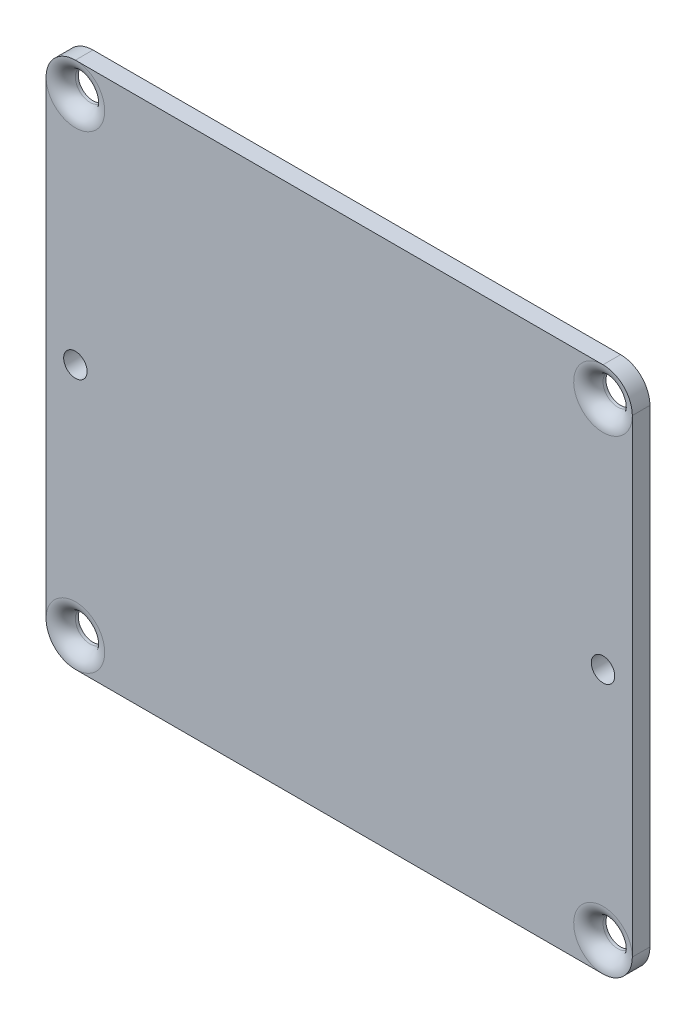
ISO-10303-21;
HEADER;
FILE_DESCRIPTION(('STEP AP214'),'2;1');
FILE_NAME('part.step','',(''),(''),'','','');
FILE_SCHEMA(('AUTOMOTIVE_DESIGN { 1 0 10303 214 1 1 1 1 }'));
ENDSEC;
DATA;
#1=APPLICATION_CONTEXT('core data for automotive mechanical design processes');
#2=APPLICATION_PROTOCOL_DEFINITION('international standard','automotive_design',2000,#1);
#3=PRODUCT_CONTEXT('',#1,'mechanical');
#4=PRODUCT('Part','Part','',(#3));
#5=PRODUCT_RELATED_PRODUCT_CATEGORY('part','',(#4));
#6=PRODUCT_DEFINITION_FORMATION('','',#4);
#7=PRODUCT_DEFINITION_CONTEXT('part definition',#1,'design');
#8=PRODUCT_DEFINITION('design','',#6,#7);
#9=PRODUCT_DEFINITION_SHAPE('','',#8);
#10=(LENGTH_UNIT() NAMED_UNIT(*) SI_UNIT(.MILLI.,.METRE.));
#11=(NAMED_UNIT(*) PLANE_ANGLE_UNIT() SI_UNIT($,.RADIAN.));
#12=(NAMED_UNIT(*) SI_UNIT($,.STERADIAN.) SOLID_ANGLE_UNIT());
#13=UNCERTAINTY_MEASURE_WITH_UNIT(LENGTH_MEASURE(1.E-05),#10,'distance_accuracy_value','');
#14=(GEOMETRIC_REPRESENTATION_CONTEXT(3) GLOBAL_UNCERTAINTY_ASSIGNED_CONTEXT((#13)) GLOBAL_UNIT_ASSIGNED_CONTEXT((#10,
#11,#12)) REPRESENTATION_CONTEXT('',''));
#15=CARTESIAN_POINT('',(0.,0.,0.));
#16=DIRECTION('',(0.,0.,1.));
#17=DIRECTION('',(1.,0.,0.));
#18=AXIS2_PLACEMENT_3D('',#15,#16,#17);
#19=CARTESIAN_POINT('',(0.,0.,3.81));
#20=DIRECTION('',(0.,0.,1.));
#21=DIRECTION('',(1.,0.,0.));
#22=AXIS2_PLACEMENT_3D('',#19,#20,#21);
#23=PLANE('',#22);
#24=CARTESIAN_POINT('',(120.65,57.15,3.81));
#25=DIRECTION('',(0.,0.,1.));
#26=DIRECTION('',(1.,0.,0.));
#27=AXIS2_PLACEMENT_3D('',#24,#25,#26);
#28=CIRCLE('',#27,2.54);
#29=CARTESIAN_POINT('',(118.11,57.15,3.81));
#30=VERTEX_POINT('',#29);
#31=EDGE_CURVE('E324',#30,#30,#28,.T.);
#32=ORIENTED_EDGE('',*,*,#31,.F.);
#33=EDGE_LOOP('',(#32));
#34=FACE_BOUND('',#33,.T.);
#35=CARTESIAN_POINT('',(6.35,57.15,3.81));
#36=DIRECTION('',(0.,0.,1.));
#37=DIRECTION('',(1.,0.,0.));
#38=AXIS2_PLACEMENT_3D('',#35,#36,#37);
#39=CIRCLE('',#38,2.54);
#40=CARTESIAN_POINT('',(3.81,57.15,3.81));
#41=VERTEX_POINT('',#40);
#42=EDGE_CURVE('E294',#41,#41,#39,.T.);
#43=ORIENTED_EDGE('',*,*,#42,.F.);
#44=EDGE_LOOP('',(#43));
#45=FACE_BOUND('',#44,.T.);
#46=DIRECTION('',(0.,1.,0.));
#47=VECTOR('',#46,1.);
#48=CARTESIAN_POINT('',(0.,0.,3.81));
#49=LINE('',#48,#47);
#50=CARTESIAN_POINT('',(0.,6.35,3.81));
#51=VERTEX_POINT('',#50);
#52=CARTESIAN_POINT('',(0.,107.95,3.81));
#53=VERTEX_POINT('',#52);
#54=EDGE_CURVE('E259',#51,#53,#49,.T.);
#55=ORIENTED_EDGE('',*,*,#54,.F.);
#56=CARTESIAN_POINT('',(6.35,6.35,3.81));
#57=DIRECTION('',(0.,0.,1.));
#58=DIRECTION('',(1.,0.,0.));
#59=AXIS2_PLACEMENT_3D('',#56,#57,#58);
#60=CIRCLE('',#59,6.35);
#61=CARTESIAN_POINT('',(6.35,0.,3.81));
#62=VERTEX_POINT('',#61);
#63=EDGE_CURVE('E227',#51,#62,#60,.F.);
#64=ORIENTED_EDGE('',*,*,#63,.T.);
#65=DIRECTION('',(1.,0.,0.));
#66=VECTOR('',#65,1.);
#67=CARTESIAN_POINT('',(0.,0.,3.81));
#68=LINE('',#67,#66);
#69=CARTESIAN_POINT('',(120.65,0.,3.81));
#70=VERTEX_POINT('',#69);
#71=EDGE_CURVE('E286',#62,#70,#68,.T.);
#72=ORIENTED_EDGE('',*,*,#71,.T.);
#73=CARTESIAN_POINT('',(120.65,6.35,3.81));
#74=DIRECTION('',(0.,0.,1.));
#75=DIRECTION('',(1.,0.,0.));
#76=AXIS2_PLACEMENT_3D('',#73,#74,#75);
#77=CIRCLE('',#76,6.35);
#78=CARTESIAN_POINT('',(127.,6.35,3.81));
#79=VERTEX_POINT('',#78);
#80=EDGE_CURVE('E272',#70,#79,#77,.F.);
#81=ORIENTED_EDGE('',*,*,#80,.T.);
#82=DIRECTION('',(0.,1.,0.));
#83=VECTOR('',#82,1.);
#84=CARTESIAN_POINT('',(127.,0.,3.81));
#85=LINE('',#84,#83);
#86=CARTESIAN_POINT('',(127.,107.95,3.81));
#87=VERTEX_POINT('',#86);
#88=EDGE_CURVE('E217',#79,#87,#85,.T.);
#89=ORIENTED_EDGE('',*,*,#88,.T.);
#90=CARTESIAN_POINT('',(120.65,107.95,3.81));
#91=DIRECTION('',(0.,0.,1.));
#92=DIRECTION('',(1.,0.,0.));
#93=AXIS2_PLACEMENT_3D('',#90,#91,#92);
#94=CIRCLE('',#93,6.35);
#95=CARTESIAN_POINT('',(120.65,114.3,3.81));
#96=VERTEX_POINT('',#95);
#97=EDGE_CURVE('E216',#87,#96,#94,.F.);
#98=ORIENTED_EDGE('',*,*,#97,.T.);
#99=DIRECTION('',(1.,0.,0.));
#100=VECTOR('',#99,1.);
#101=CARTESIAN_POINT('',(0.,114.3,3.81));
#102=LINE('',#101,#100);
#103=CARTESIAN_POINT('',(6.35,114.3,3.81));
#104=VERTEX_POINT('',#103);
#105=EDGE_CURVE('E194',#104,#96,#102,.T.);
#106=ORIENTED_EDGE('',*,*,#105,.F.);
#107=CARTESIAN_POINT('',(6.35,107.95,3.81));
#108=DIRECTION('',(0.,0.,1.));
#109=DIRECTION('',(1.,0.,0.));
#110=AXIS2_PLACEMENT_3D('',#107,#108,#109);
#111=CIRCLE('',#110,6.35);
#112=EDGE_CURVE('E204',#104,#53,#111,.F.);
#113=ORIENTED_EDGE('',*,*,#112,.T.);
#114=EDGE_LOOP('',(#55,#64,#72,#81,#89,#98,#106,#113));
#115=FACE_BOUND('',#114,.T.);
#116=ADVANCED_FACE('F123',(#34,#45,#115),#23,.T.);
#117=CARTESIAN_POINT('',(0.,0.,0.));
#118=DIRECTION('',(0.,0.,1.));
#119=DIRECTION('',(1.,0.,0.));
#120=AXIS2_PLACEMENT_3D('',#117,#118,#119);
#121=PLANE('',#120);
#122=DIRECTION('',(1.,0.,0.));
#123=VECTOR('',#122,1.);
#124=CARTESIAN_POINT('',(0.,114.3,0.));
#125=LINE('',#124,#123);
#126=CARTESIAN_POINT('',(6.35,114.3,0.));
#127=VERTEX_POINT('',#126);
#128=CARTESIAN_POINT('',(120.65,114.3,0.));
#129=VERTEX_POINT('',#128);
#130=EDGE_CURVE('E197',#127,#129,#125,.T.);
#131=ORIENTED_EDGE('',*,*,#130,.T.);
#132=CARTESIAN_POINT('',(120.65,107.95,0.));
#133=DIRECTION('',(0.,0.,1.));
#134=DIRECTION('',(1.,0.,0.));
#135=AXIS2_PLACEMENT_3D('',#132,#133,#134);
#136=CIRCLE('',#135,6.35);
#137=CARTESIAN_POINT('',(127.,107.95,0.));
#138=VERTEX_POINT('',#137);
#139=EDGE_CURVE('E245',#129,#138,#136,.F.);
#140=ORIENTED_EDGE('',*,*,#139,.T.);
#141=DIRECTION('',(0.,1.,0.));
#142=VECTOR('',#141,1.);
#143=CARTESIAN_POINT('',(127.,0.,0.));
#144=LINE('',#143,#142);
#145=CARTESIAN_POINT('',(127.,6.35,0.));
#146=VERTEX_POINT('',#145);
#147=EDGE_CURVE('E265',#146,#138,#144,.T.);
#148=ORIENTED_EDGE('',*,*,#147,.F.);
#149=CARTESIAN_POINT('',(120.65,6.35,0.));
#150=DIRECTION('',(0.,0.,1.));
#151=DIRECTION('',(1.,0.,0.));
#152=AXIS2_PLACEMENT_3D('',#149,#150,#151);
#153=CIRCLE('',#152,6.35);
#154=CARTESIAN_POINT('',(120.65,0.,0.));
#155=VERTEX_POINT('',#154);
#156=EDGE_CURVE('E243',#146,#155,#153,.F.);
#157=ORIENTED_EDGE('',*,*,#156,.T.);
#158=DIRECTION('',(1.,0.,0.));
#159=VECTOR('',#158,1.);
#160=CARTESIAN_POINT('',(0.,0.,0.));
#161=LINE('',#160,#159);
#162=CARTESIAN_POINT('',(6.35,0.,0.));
#163=VERTEX_POINT('',#162);
#164=EDGE_CURVE('E262',#163,#155,#161,.T.);
#165=ORIENTED_EDGE('',*,*,#164,.F.);
#166=CARTESIAN_POINT('',(6.35,6.35,0.));
#167=DIRECTION('',(0.,0.,1.));
#168=DIRECTION('',(1.,0.,0.));
#169=AXIS2_PLACEMENT_3D('',#166,#167,#168);
#170=CIRCLE('',#169,6.35);
#171=CARTESIAN_POINT('',(0.,6.35,0.));
#172=VERTEX_POINT('',#171);
#173=EDGE_CURVE('E146',#163,#172,#170,.F.);
#174=ORIENTED_EDGE('',*,*,#173,.T.);
#175=DIRECTION('',(0.,1.,0.));
#176=VECTOR('',#175,1.);
#177=CARTESIAN_POINT('',(0.,0.,0.));
#178=LINE('',#177,#176);
#179=CARTESIAN_POINT('',(0.,107.95,0.));
#180=VERTEX_POINT('',#179);
#181=EDGE_CURVE('E218',#172,#180,#178,.T.);
#182=ORIENTED_EDGE('',*,*,#181,.T.);
#183=CARTESIAN_POINT('',(6.35,107.95,0.));
#184=DIRECTION('',(0.,0.,1.));
#185=DIRECTION('',(1.,0.,0.));
#186=AXIS2_PLACEMENT_3D('',#183,#184,#185);
#187=CIRCLE('',#186,6.35);
#188=EDGE_CURVE('E138',#180,#127,#187,.F.);
#189=ORIENTED_EDGE('',*,*,#188,.T.);
#190=EDGE_LOOP('',(#131,#140,#148,#157,#165,#174,#182,#189));
#191=FACE_BOUND('',#190,.T.);
#192=CARTESIAN_POINT('',(6.35,57.15,0.));
#193=DIRECTION('',(0.,0.,1.));
#194=DIRECTION('',(1.,0.,0.));
#195=AXIS2_PLACEMENT_3D('',#192,#193,#194);
#196=CIRCLE('',#195,2.54);
#197=CARTESIAN_POINT('',(3.81,57.15,0.));
#198=VERTEX_POINT('',#197);
#199=EDGE_CURVE('E332',#198,#198,#196,.T.);
#200=ORIENTED_EDGE('',*,*,#199,.T.);
#201=EDGE_LOOP('',(#200));
#202=FACE_BOUND('',#201,.T.);
#203=CARTESIAN_POINT('',(120.65,57.15,0.));
#204=DIRECTION('',(0.,0.,1.));
#205=DIRECTION('',(1.,0.,0.));
#206=AXIS2_PLACEMENT_3D('',#203,#204,#205);
#207=CIRCLE('',#206,2.54);
#208=CARTESIAN_POINT('',(118.11,57.15,0.));
#209=VERTEX_POINT('',#208);
#210=EDGE_CURVE('E320',#209,#209,#207,.T.);
#211=ORIENTED_EDGE('',*,*,#210,.T.);
#212=EDGE_LOOP('',(#211));
#213=FACE_BOUND('',#212,.T.);
#214=CARTESIAN_POINT('',(120.65,107.95,0.));
#215=DIRECTION('',(0.,0.,1.));
#216=DIRECTION('',(1.,0.,0.));
#217=AXIS2_PLACEMENT_3D('',#214,#215,#216);
#218=CIRCLE('',#217,3.175);
#219=CARTESIAN_POINT('',(117.475,107.95,0.));
#220=VERTEX_POINT('',#219);
#221=EDGE_CURVE('E318',#220,#220,#218,.T.);
#222=ORIENTED_EDGE('',*,*,#221,.T.);
#223=EDGE_LOOP('',(#222));
#224=FACE_BOUND('',#223,.T.);
#225=CARTESIAN_POINT('',(6.35,107.95,0.));
#226=DIRECTION('',(0.,0.,1.));
#227=DIRECTION('',(1.,0.,0.));
#228=AXIS2_PLACEMENT_3D('',#225,#226,#227);
#229=CIRCLE('',#228,3.175);
#230=CARTESIAN_POINT('',(3.175,107.95,0.));
#231=VERTEX_POINT('',#230);
#232=EDGE_CURVE('E321',#231,#231,#229,.T.);
#233=ORIENTED_EDGE('',*,*,#232,.T.);
#234=EDGE_LOOP('',(#233));
#235=FACE_BOUND('',#234,.T.);
#236=CARTESIAN_POINT('',(6.35,6.35,0.));
#237=DIRECTION('',(0.,0.,1.));
#238=DIRECTION('',(1.,0.,0.));
#239=AXIS2_PLACEMENT_3D('',#236,#237,#238);
#240=CIRCLE('',#239,3.175);
#241=CARTESIAN_POINT('',(3.175,6.35,0.));
#242=VERTEX_POINT('',#241);
#243=EDGE_CURVE('E327',#242,#242,#240,.T.);
#244=ORIENTED_EDGE('',*,*,#243,.T.);
#245=EDGE_LOOP('',(#244));
#246=FACE_BOUND('',#245,.T.);
#247=CARTESIAN_POINT('',(120.65,6.35,0.));
#248=DIRECTION('',(0.,0.,1.));
#249=DIRECTION('',(1.,0.,0.));
#250=AXIS2_PLACEMENT_3D('',#247,#248,#249);
#251=CIRCLE('',#250,3.175);
#252=CARTESIAN_POINT('',(117.475,6.35,0.));
#253=VERTEX_POINT('',#252);
#254=EDGE_CURVE('E396',#253,#253,#251,.T.);
#255=ORIENTED_EDGE('',*,*,#254,.T.);
#256=EDGE_LOOP('',(#255));
#257=FACE_BOUND('',#256,.T.);
#258=ADVANCED_FACE('F260',(#191,#202,#213,#224,#235,#246,#257),#121,.F.);
#259=CARTESIAN_POINT('',(0.,114.3,3.81));
#260=DIRECTION('',(0.,1.,0.));
#261=DIRECTION('',(0.,0.,1.));
#262=AXIS2_PLACEMENT_3D('',#259,#260,#261);
#263=PLANE('',#262);
#264=ORIENTED_EDGE('',*,*,#105,.T.);
#265=DIRECTION('',(0.,0.,-1.));
#266=VECTOR('',#265,1.);
#267=CARTESIAN_POINT('',(120.65,114.3,0.));
#268=LINE('',#267,#266);
#269=EDGE_CURVE('E199',#96,#129,#268,.T.);
#270=ORIENTED_EDGE('',*,*,#269,.T.);
#271=ORIENTED_EDGE('',*,*,#130,.F.);
#272=DIRECTION('',(0.,0.,-1.));
#273=VECTOR('',#272,1.);
#274=CARTESIAN_POINT('',(6.35,114.3,3.81));
#275=LINE('',#274,#273);
#276=EDGE_CURVE('E189',#127,#104,#275,.F.);
#277=ORIENTED_EDGE('',*,*,#276,.T.);
#278=EDGE_LOOP('',(#264,#270,#271,#277));
#279=FACE_BOUND('',#278,.T.);
#280=ADVANCED_FACE('F191',(#279),#263,.T.);
#281=CARTESIAN_POINT('',(0.,0.,3.81));
#282=DIRECTION('',(-1.,0.,0.));
#283=DIRECTION('',(0.,0.,1.));
#284=AXIS2_PLACEMENT_3D('',#281,#282,#283);
#285=PLANE('',#284);
#286=ORIENTED_EDGE('',*,*,#181,.F.);
#287=DIRECTION('',(0.,0.,-1.));
#288=VECTOR('',#287,1.);
#289=CARTESIAN_POINT('',(0.,6.35,3.81));
#290=LINE('',#289,#288);
#291=EDGE_CURVE('E12',#172,#51,#290,.F.);
#292=ORIENTED_EDGE('',*,*,#291,.T.);
#293=ORIENTED_EDGE('',*,*,#54,.T.);
#294=DIRECTION('',(0.,0.,-1.));
#295=VECTOR('',#294,1.);
#296=CARTESIAN_POINT('',(0.,107.95,3.81));
#297=LINE('',#296,#295);
#298=EDGE_CURVE('E131',#53,#180,#297,.T.);
#299=ORIENTED_EDGE('',*,*,#298,.T.);
#300=EDGE_LOOP('',(#286,#292,#293,#299));
#301=FACE_BOUND('',#300,.T.);
#302=ADVANCED_FACE('F257',(#301),#285,.T.);
#303=CARTESIAN_POINT('',(0.,0.,3.81));
#304=DIRECTION('',(0.,1.,0.));
#305=DIRECTION('',(0.,0.,1.));
#306=AXIS2_PLACEMENT_3D('',#303,#304,#305);
#307=PLANE('',#306);
#308=ORIENTED_EDGE('',*,*,#164,.T.);
#309=DIRECTION('',(0.,0.,-1.));
#310=VECTOR('',#309,1.);
#311=CARTESIAN_POINT('',(120.65,0.,3.81));
#312=LINE('',#311,#310);
#313=EDGE_CURVE('E255',#155,#70,#312,.F.);
#314=ORIENTED_EDGE('',*,*,#313,.T.);
#315=ORIENTED_EDGE('',*,*,#71,.F.);
#316=DIRECTION('',(0.,0.,-1.));
#317=VECTOR('',#316,1.);
#318=CARTESIAN_POINT('',(6.35,0.,0.));
#319=LINE('',#318,#317);
#320=EDGE_CURVE('E252',#62,#163,#319,.T.);
#321=ORIENTED_EDGE('',*,*,#320,.T.);
#322=EDGE_LOOP('',(#308,#314,#315,#321));
#323=FACE_BOUND('',#322,.T.);
#324=ADVANCED_FACE('F350',(#323),#307,.F.);
#325=CARTESIAN_POINT('',(127.,0.,3.81));
#326=DIRECTION('',(-1.,0.,0.));
#327=DIRECTION('',(0.,0.,1.));
#328=AXIS2_PLACEMENT_3D('',#325,#326,#327);
#329=PLANE('',#328);
#330=ORIENTED_EDGE('',*,*,#147,.T.);
#331=DIRECTION('',(0.,0.,-1.));
#332=VECTOR('',#331,1.);
#333=CARTESIAN_POINT('',(127.,107.95,3.81));
#334=LINE('',#333,#332);
#335=EDGE_CURVE('E250',#138,#87,#334,.F.);
#336=ORIENTED_EDGE('',*,*,#335,.T.);
#337=ORIENTED_EDGE('',*,*,#88,.F.);
#338=DIRECTION('',(0.,0.,-1.));
#339=VECTOR('',#338,1.);
#340=CARTESIAN_POINT('',(127.,6.35,3.81));
#341=LINE('',#340,#339);
#342=EDGE_CURVE('E247',#79,#146,#341,.T.);
#343=ORIENTED_EDGE('',*,*,#342,.T.);
#344=EDGE_LOOP('',(#330,#336,#337,#343));
#345=FACE_BOUND('',#344,.T.);
#346=ADVANCED_FACE('F299',(#345),#329,.F.);
#347=CARTESIAN_POINT('',(6.35,57.15,3.81));
#348=DIRECTION('',(0.,0.,-1.));
#349=DIRECTION('',(-1.,0.,0.));
#350=AXIS2_PLACEMENT_3D('',#347,#348,#349);
#351=CYLINDRICAL_SURFACE('',#350,2.54);
#352=CARTESIAN_POINT('',(3.81,57.15,3.81));
#353=CARTESIAN_POINT('',(3.81,57.15,3.7703125));
#354=CARTESIAN_POINT('',(3.81,57.15,3.730625));
#355=CARTESIAN_POINT('',(3.81,57.15,3.65125));
#356=CARTESIAN_POINT('',(3.81,57.15,3.6115625));
#357=CARTESIAN_POINT('',(3.81,57.15,3.5321875));
#358=CARTESIAN_POINT('',(3.81,57.15,3.4925));
#359=CARTESIAN_POINT('',(3.81,57.15,3.413125));
#360=CARTESIAN_POINT('',(3.81,57.15,3.3734375));
#361=CARTESIAN_POINT('',(3.81,57.15,3.2940625));
#362=CARTESIAN_POINT('',(3.81,57.15,3.254375));
#363=CARTESIAN_POINT('',(3.81,57.15,3.175));
#364=CARTESIAN_POINT('',(3.81,57.15,3.1353125));
#365=CARTESIAN_POINT('',(3.81,57.15,3.0559375));
#366=CARTESIAN_POINT('',(3.81,57.15,3.01625));
#367=CARTESIAN_POINT('',(3.81,57.15,2.936875));
#368=CARTESIAN_POINT('',(3.81,57.15,2.8971875));
#369=CARTESIAN_POINT('',(3.81,57.15,2.8178125));
#370=CARTESIAN_POINT('',(3.81,57.15,2.778125));
#371=CARTESIAN_POINT('',(3.81,57.15,2.69875));
#372=CARTESIAN_POINT('',(3.81,57.15,2.6590625));
#373=CARTESIAN_POINT('',(3.81,57.15,2.5796875));
#374=CARTESIAN_POINT('',(3.81,57.15,2.54));
#375=CARTESIAN_POINT('',(3.81,57.15,2.460625));
#376=CARTESIAN_POINT('',(3.81,57.15,2.4209375));
#377=CARTESIAN_POINT('',(3.81,57.15,2.3415625));
#378=CARTESIAN_POINT('',(3.81,57.15,2.301875));
#379=CARTESIAN_POINT('',(3.81,57.15,2.2225));
#380=CARTESIAN_POINT('',(3.81,57.15,2.1828125));
#381=CARTESIAN_POINT('',(3.81,57.15,2.1034375));
#382=CARTESIAN_POINT('',(3.81,57.15,2.06375));
#383=CARTESIAN_POINT('',(3.81,57.15,1.984375));
#384=CARTESIAN_POINT('',(3.81,57.15,1.9446875));
#385=CARTESIAN_POINT('',(3.81,57.15,1.8653125));
#386=CARTESIAN_POINT('',(3.81,57.15,1.825625));
#387=CARTESIAN_POINT('',(3.81,57.15,1.74625));
#388=CARTESIAN_POINT('',(3.81,57.15,1.7065625));
#389=CARTESIAN_POINT('',(3.81,57.15,1.6271875));
#390=CARTESIAN_POINT('',(3.81,57.15,1.5875));
#391=CARTESIAN_POINT('',(3.81,57.15,1.508125));
#392=CARTESIAN_POINT('',(3.81,57.15,1.4684375));
#393=CARTESIAN_POINT('',(3.81,57.15,1.3890625));
#394=CARTESIAN_POINT('',(3.81,57.15,1.349375));
#395=CARTESIAN_POINT('',(3.81,57.15,1.27));
#396=CARTESIAN_POINT('',(3.81,57.15,1.2303125));
#397=CARTESIAN_POINT('',(3.81,57.15,1.1509375));
#398=CARTESIAN_POINT('',(3.81,57.15,1.11125));
#399=CARTESIAN_POINT('',(3.81,57.15,1.031875));
#400=CARTESIAN_POINT('',(3.81,57.15,0.9921875));
#401=CARTESIAN_POINT('',(3.81,57.15,0.9128125));
#402=CARTESIAN_POINT('',(3.81,57.15,0.873125));
#403=CARTESIAN_POINT('',(3.81,57.15,0.79375));
#404=CARTESIAN_POINT('',(3.81,57.15,0.7540625));
#405=CARTESIAN_POINT('',(3.81,57.15,0.6746875));
#406=CARTESIAN_POINT('',(3.81,57.15,0.635));
#407=CARTESIAN_POINT('',(3.81,57.15,0.555625));
#408=CARTESIAN_POINT('',(3.81,57.15,0.5159375));
#409=CARTESIAN_POINT('',(3.81,57.15,0.4365625));
#410=CARTESIAN_POINT('',(3.81,57.15,0.396875));
#411=CARTESIAN_POINT('',(3.81,57.15,0.3175));
#412=CARTESIAN_POINT('',(3.81,57.15,0.2778125));
#413=CARTESIAN_POINT('',(3.81,57.15,0.1984375));
#414=CARTESIAN_POINT('',(3.81,57.15,0.15875));
#415=CARTESIAN_POINT('',(3.81,57.15,0.0793749999999999));
#416=CARTESIAN_POINT('',(3.81,57.15,0.0396874999999999));
#417=CARTESIAN_POINT('',(3.81,57.15,0.));
#418=B_SPLINE_CURVE_WITH_KNOTS('',3,(#352,#353,#354,#355,#356,#357,#358,#359,#360,#361,#362,
#363,#364,#365,#366,#367,#368,#369,#370,#371,#372,#373,#374,#375,#376,#377,#378,#379,#380,#381,
#382,#383,#384,#385,#386,#387,#388,#389,#390,#391,#392,#393,#394,#395,#396,#397,#398,#399,#400,
#401,#402,#403,#404,#405,#406,#407,#408,#409,#410,#411,#412,#413,#414,#415,#416,#417),
.UNSPECIFIED.,.F.,.F.,(4,2,2,2,2,2,2,2,2,2,2,2,2,2,2,2,2,2,2,2,2,2,2,2,2,2,2,2,2,2,2,2,4),(0.,
0.1190625,0.238125,0.3571875,0.47625,0.5953125,0.714375,0.8334375,0.9525,1.0715625,1.190625,
1.3096875,1.42875,1.5478125,1.666875,1.7859375,1.905,2.0240625,2.143125,2.2621875,2.38125,
2.5003125,2.619375,2.7384375,2.8575,2.9765625,3.095625,3.2146875,3.33375,3.4528125,3.571875,
3.6909375,3.81),.UNSPECIFIED.);
#419=EDGE_CURVE('BSEAM340',#41,#198,#418,.T.);
#420=ORIENTED_EDGE('',*,*,#42,.T.);
#421=ORIENTED_EDGE('',*,*,#199,.F.);
#422=ORIENTED_EDGE('',*,*,#419,.T.);
#423=ORIENTED_EDGE('',*,*,#419,.F.);
#424=EDGE_LOOP('',(#420,#422,#421,#423));
#425=FACE_BOUND('',#424,.T.);
#426=ADVANCED_FACE('F340',(#425),#351,.F.);
#427=CARTESIAN_POINT('',(120.65,57.15,3.81));
#428=DIRECTION('',(0.,0.,-1.));
#429=DIRECTION('',(-1.,0.,0.));
#430=AXIS2_PLACEMENT_3D('',#427,#428,#429);
#431=CYLINDRICAL_SURFACE('',#430,2.54);
#432=CARTESIAN_POINT('',(118.11,57.15,3.81));
#433=CARTESIAN_POINT('',(118.11,57.15,3.7703125));
#434=CARTESIAN_POINT('',(118.11,57.15,3.730625));
#435=CARTESIAN_POINT('',(118.11,57.15,3.65125));
#436=CARTESIAN_POINT('',(118.11,57.15,3.6115625));
#437=CARTESIAN_POINT('',(118.11,57.15,3.5321875));
#438=CARTESIAN_POINT('',(118.11,57.15,3.4925));
#439=CARTESIAN_POINT('',(118.11,57.15,3.413125));
#440=CARTESIAN_POINT('',(118.11,57.15,3.3734375));
#441=CARTESIAN_POINT('',(118.11,57.15,3.2940625));
#442=CARTESIAN_POINT('',(118.11,57.15,3.254375));
#443=CARTESIAN_POINT('',(118.11,57.15,3.175));
#444=CARTESIAN_POINT('',(118.11,57.15,3.1353125));
#445=CARTESIAN_POINT('',(118.11,57.15,3.0559375));
#446=CARTESIAN_POINT('',(118.11,57.15,3.01625));
#447=CARTESIAN_POINT('',(118.11,57.15,2.936875));
#448=CARTESIAN_POINT('',(118.11,57.15,2.8971875));
#449=CARTESIAN_POINT('',(118.11,57.15,2.8178125));
#450=CARTESIAN_POINT('',(118.11,57.15,2.778125));
#451=CARTESIAN_POINT('',(118.11,57.15,2.69875));
#452=CARTESIAN_POINT('',(118.11,57.15,2.6590625));
#453=CARTESIAN_POINT('',(118.11,57.15,2.5796875));
#454=CARTESIAN_POINT('',(118.11,57.15,2.54));
#455=CARTESIAN_POINT('',(118.11,57.15,2.460625));
#456=CARTESIAN_POINT('',(118.11,57.15,2.4209375));
#457=CARTESIAN_POINT('',(118.11,57.15,2.3415625));
#458=CARTESIAN_POINT('',(118.11,57.15,2.301875));
#459=CARTESIAN_POINT('',(118.11,57.15,2.2225));
#460=CARTESIAN_POINT('',(118.11,57.15,2.1828125));
#461=CARTESIAN_POINT('',(118.11,57.15,2.1034375));
#462=CARTESIAN_POINT('',(118.11,57.15,2.06375));
#463=CARTESIAN_POINT('',(118.11,57.15,1.984375));
#464=CARTESIAN_POINT('',(118.11,57.15,1.9446875));
#465=CARTESIAN_POINT('',(118.11,57.15,1.8653125));
#466=CARTESIAN_POINT('',(118.11,57.15,1.825625));
#467=CARTESIAN_POINT('',(118.11,57.15,1.74625));
#468=CARTESIAN_POINT('',(118.11,57.15,1.7065625));
#469=CARTESIAN_POINT('',(118.11,57.15,1.6271875));
#470=CARTESIAN_POINT('',(118.11,57.15,1.5875));
#471=CARTESIAN_POINT('',(118.11,57.15,1.508125));
#472=CARTESIAN_POINT('',(118.11,57.15,1.4684375));
#473=CARTESIAN_POINT('',(118.11,57.15,1.3890625));
#474=CARTESIAN_POINT('',(118.11,57.15,1.349375));
#475=CARTESIAN_POINT('',(118.11,57.15,1.27));
#476=CARTESIAN_POINT('',(118.11,57.15,1.2303125));
#477=CARTESIAN_POINT('',(118.11,57.15,1.1509375));
#478=CARTESIAN_POINT('',(118.11,57.15,1.11125));
#479=CARTESIAN_POINT('',(118.11,57.15,1.031875));
#480=CARTESIAN_POINT('',(118.11,57.15,0.9921875));
#481=CARTESIAN_POINT('',(118.11,57.15,0.9128125));
#482=CARTESIAN_POINT('',(118.11,57.15,0.873125));
#483=CARTESIAN_POINT('',(118.11,57.15,0.79375));
#484=CARTESIAN_POINT('',(118.11,57.15,0.7540625));
#485=CARTESIAN_POINT('',(118.11,57.15,0.6746875));
#486=CARTESIAN_POINT('',(118.11,57.15,0.635));
#487=CARTESIAN_POINT('',(118.11,57.15,0.555625));
#488=CARTESIAN_POINT('',(118.11,57.15,0.5159375));
#489=CARTESIAN_POINT('',(118.11,57.15,0.4365625));
#490=CARTESIAN_POINT('',(118.11,57.15,0.396875));
#491=CARTESIAN_POINT('',(118.11,57.15,0.3175));
#492=CARTESIAN_POINT('',(118.11,57.15,0.2778125));
#493=CARTESIAN_POINT('',(118.11,57.15,0.1984375));
#494=CARTESIAN_POINT('',(118.11,57.15,0.15875));
#495=CARTESIAN_POINT('',(118.11,57.15,0.0793749999999999));
#496=CARTESIAN_POINT('',(118.11,57.15,0.0396874999999999));
#497=CARTESIAN_POINT('',(118.11,57.15,0.));
#498=B_SPLINE_CURVE_WITH_KNOTS('',3,(#432,#433,#434,#435,#436,#437,#438,#439,#440,#441,#442,
#443,#444,#445,#446,#447,#448,#449,#450,#451,#452,#453,#454,#455,#456,#457,#458,#459,#460,#461,
#462,#463,#464,#465,#466,#467,#468,#469,#470,#471,#472,#473,#474,#475,#476,#477,#478,#479,#480,
#481,#482,#483,#484,#485,#486,#487,#488,#489,#490,#491,#492,#493,#494,#495,#496,#497),
.UNSPECIFIED.,.F.,.F.,(4,2,2,2,2,2,2,2,2,2,2,2,2,2,2,2,2,2,2,2,2,2,2,2,2,2,2,2,2,2,2,2,4),(0.,
0.1190625,0.238125,0.3571875,0.47625,0.5953125,0.714375,0.8334375,0.9525,1.0715625,1.190625,
1.3096875,1.42875,1.5478125,1.666875,1.7859375,1.905,2.0240625,2.143125,2.2621875,2.38125,
2.5003125,2.619375,2.7384375,2.8575,2.9765625,3.095625,3.2146875,3.33375,3.4528125,3.571875,
3.6909375,3.81),.UNSPECIFIED.);
#499=EDGE_CURVE('BSEAM314',#30,#209,#498,.T.);
#500=ORIENTED_EDGE('',*,*,#31,.T.);
#501=ORIENTED_EDGE('',*,*,#210,.F.);
#502=ORIENTED_EDGE('',*,*,#499,.T.);
#503=ORIENTED_EDGE('',*,*,#499,.F.);
#504=EDGE_LOOP('',(#500,#502,#501,#503));
#505=FACE_BOUND('',#504,.T.);
#506=ADVANCED_FACE('F314',(#505),#431,.F.);
#507=CARTESIAN_POINT('',(120.65,107.95,3.81));
#508=DIRECTION('',(0.,0.,-1.));
#509=DIRECTION('',(-1.,0.,0.));
#510=AXIS2_PLACEMENT_3D('',#507,#508,#509);
#511=CYLINDRICAL_SURFACE('',#510,3.175);
#512=CARTESIAN_POINT('',(120.65,107.95,0.635));
#513=DIRECTION('',(0.,0.,1.));
#514=DIRECTION('',(1.,0.,0.));
#515=AXIS2_PLACEMENT_3D('',#512,#513,#514);
#516=CIRCLE('',#515,3.175);
#517=CARTESIAN_POINT('',(117.475,107.95,0.635));
#518=VERTEX_POINT('',#517);
#519=EDGE_CURVE('E232',#518,#518,#516,.T.);
#520=CARTESIAN_POINT('',(117.475,107.95,0.635));
#521=CARTESIAN_POINT('',(117.475,107.95,0.628385416666667));
#522=CARTESIAN_POINT('',(117.475,107.95,0.621770833333334));
#523=CARTESIAN_POINT('',(117.475,107.95,0.608541666666667));
#524=CARTESIAN_POINT('',(117.475,107.95,0.601927083333334));
#525=CARTESIAN_POINT('',(117.475,107.95,0.588697916666667));
#526=CARTESIAN_POINT('',(117.475,107.95,0.582083333333333));
#527=CARTESIAN_POINT('',(117.475,107.95,0.568854166666667));
#528=CARTESIAN_POINT('',(117.475,107.95,0.562239583333333));
#529=CARTESIAN_POINT('',(117.475,107.95,0.549010416666667));
#530=CARTESIAN_POINT('',(117.475,107.95,0.542395833333334));
#531=CARTESIAN_POINT('',(117.475,107.95,0.529166666666667));
#532=CARTESIAN_POINT('',(117.475,107.95,0.522552083333333));
#533=CARTESIAN_POINT('',(117.475,107.95,0.509322916666667));
#534=CARTESIAN_POINT('',(117.475,107.95,0.502708333333333));
#535=CARTESIAN_POINT('',(117.475,107.95,0.489479166666667));
#536=CARTESIAN_POINT('',(117.475,107.95,0.482864583333333));
#537=CARTESIAN_POINT('',(117.475,107.95,0.469635416666667));
#538=CARTESIAN_POINT('',(117.475,107.95,0.463020833333333));
#539=CARTESIAN_POINT('',(117.475,107.95,0.449791666666667));
#540=CARTESIAN_POINT('',(117.475,107.95,0.443177083333334));
#541=CARTESIAN_POINT('',(117.475,107.95,0.429947916666667));
#542=CARTESIAN_POINT('',(117.475,107.95,0.423333333333333));
#543=CARTESIAN_POINT('',(117.475,107.95,0.410104166666667));
#544=CARTESIAN_POINT('',(117.475,107.95,0.403489583333333));
#545=CARTESIAN_POINT('',(117.475,107.95,0.390260416666667));
#546=CARTESIAN_POINT('',(117.475,107.95,0.383645833333334));
#547=CARTESIAN_POINT('',(117.475,107.95,0.370416666666667));
#548=CARTESIAN_POINT('',(117.475,107.95,0.363802083333333));
#549=CARTESIAN_POINT('',(117.475,107.95,0.350572916666667));
#550=CARTESIAN_POINT('',(117.475,107.95,0.343958333333333));
#551=CARTESIAN_POINT('',(117.475,107.95,0.330729166666667));
#552=CARTESIAN_POINT('',(117.475,107.95,0.324114583333333));
#553=CARTESIAN_POINT('',(117.475,107.95,0.310885416666667));
#554=CARTESIAN_POINT('',(117.475,107.95,0.304270833333333));
#555=CARTESIAN_POINT('',(117.475,107.95,0.291041666666667));
#556=CARTESIAN_POINT('',(117.475,107.95,0.284427083333334));
#557=CARTESIAN_POINT('',(117.475,107.95,0.271197916666667));
#558=CARTESIAN_POINT('',(117.475,107.95,0.264583333333333));
#559=CARTESIAN_POINT('',(117.475,107.95,0.251354166666667));
#560=CARTESIAN_POINT('',(117.475,107.95,0.244739583333333));
#561=CARTESIAN_POINT('',(117.475,107.95,0.231510416666667));
#562=CARTESIAN_POINT('',(117.475,107.95,0.224895833333333));
#563=CARTESIAN_POINT('',(117.475,107.95,0.211666666666667));
#564=CARTESIAN_POINT('',(117.475,107.95,0.205052083333333));
#565=CARTESIAN_POINT('',(117.475,107.95,0.191822916666667));
#566=CARTESIAN_POINT('',(117.475,107.95,0.185208333333333));
#567=CARTESIAN_POINT('',(117.475,107.95,0.171979166666667));
#568=CARTESIAN_POINT('',(117.475,107.95,0.165364583333333));
#569=CARTESIAN_POINT('',(117.475,107.95,0.152135416666667));
#570=CARTESIAN_POINT('',(117.475,107.95,0.145520833333333));
#571=CARTESIAN_POINT('',(117.475,107.95,0.132291666666667));
#572=CARTESIAN_POINT('',(117.475,107.95,0.125677083333334));
#573=CARTESIAN_POINT('',(117.475,107.95,0.112447916666667));
#574=CARTESIAN_POINT('',(117.475,107.95,0.105833333333333));
#575=CARTESIAN_POINT('',(117.475,107.95,0.0926041666666666));
#576=CARTESIAN_POINT('',(117.475,107.95,0.0859895833333333));
#577=CARTESIAN_POINT('',(117.475,107.95,0.0727604166666667));
#578=CARTESIAN_POINT('',(117.475,107.95,0.0661458333333334));
#579=CARTESIAN_POINT('',(117.475,107.95,0.0529166666666667));
#580=CARTESIAN_POINT('',(117.475,107.95,0.0463020833333332));
#581=CARTESIAN_POINT('',(117.475,107.95,0.0330729166666665));
#582=CARTESIAN_POINT('',(117.475,107.95,0.0264583333333332));
#583=CARTESIAN_POINT('',(117.475,107.95,0.0132291666666666));
#584=CARTESIAN_POINT('',(117.475,107.95,0.00661458333333329));
#585=CARTESIAN_POINT('',(117.475,107.95,0.));
#586=B_SPLINE_CURVE_WITH_KNOTS('',3,(#520,#521,#522,#523,#524,#525,#526,#527,#528,#529,#530,
#531,#532,#533,#534,#535,#536,#537,#538,#539,#540,#541,#542,#543,#544,#545,#546,#547,#548,#549,
#550,#551,#552,#553,#554,#555,#556,#557,#558,#559,#560,#561,#562,#563,#564,#565,#566,#567,#568,
#569,#570,#571,#572,#573,#574,#575,#576,#577,#578,#579,#580,#581,#582,#583,#584,#585),
.UNSPECIFIED.,.F.,.F.,(4,2,2,2,2,2,2,2,2,2,2,2,2,2,2,2,2,2,2,2,2,2,2,2,2,2,2,2,2,2,2,2,4),(0.,
0.0198437499999999,0.0396874999999998,0.0595312500000001,0.079375,0.0992187499999999,0.1190625,
0.13890625,0.15875,0.17859375,0.1984375,0.21828125,0.238125,0.25796875,0.2778125,0.29765625,
0.3175,0.33734375,0.3571875,0.37703125,0.396875,0.41671875,0.4365625,0.45640625,0.47625,
0.49609375,0.5159375,0.53578125,0.555625,0.57546875,0.5953125,0.61515625,0.635),.UNSPECIFIED.);
#587=EDGE_CURVE('BSEAM310',#518,#220,#586,.T.);
#588=ORIENTED_EDGE('',*,*,#519,.T.);
#589=ORIENTED_EDGE('',*,*,#221,.F.);
#590=ORIENTED_EDGE('',*,*,#587,.T.);
#591=ORIENTED_EDGE('',*,*,#587,.F.);
#592=EDGE_LOOP('',(#588,#590,#589,#591));
#593=FACE_BOUND('',#592,.T.);
#594=ADVANCED_FACE('F310',(#593),#511,.F.);
#595=CARTESIAN_POINT('',(6.35,107.95,3.81));
#596=DIRECTION('',(0.,0.,-1.));
#597=DIRECTION('',(-1.,0.,0.));
#598=AXIS2_PLACEMENT_3D('',#595,#596,#597);
#599=CYLINDRICAL_SURFACE('',#598,3.175);
#600=CARTESIAN_POINT('',(6.35,107.95,0.635));
#601=DIRECTION('',(0.,0.,1.));
#602=DIRECTION('',(1.,0.,0.));
#603=AXIS2_PLACEMENT_3D('',#600,#601,#602);
#604=CIRCLE('',#603,3.175);
#605=CARTESIAN_POINT('',(3.175,107.95,0.635));
#606=VERTEX_POINT('',#605);
#607=EDGE_CURVE('E235',#606,#606,#604,.T.);
#608=CARTESIAN_POINT('',(3.175,107.95,0.635));
#609=CARTESIAN_POINT('',(3.175,107.95,0.628385416666667));
#610=CARTESIAN_POINT('',(3.175,107.95,0.621770833333334));
#611=CARTESIAN_POINT('',(3.175,107.95,0.608541666666667));
#612=CARTESIAN_POINT('',(3.175,107.95,0.601927083333334));
#613=CARTESIAN_POINT('',(3.175,107.95,0.588697916666667));
#614=CARTESIAN_POINT('',(3.175,107.95,0.582083333333333));
#615=CARTESIAN_POINT('',(3.175,107.95,0.568854166666667));
#616=CARTESIAN_POINT('',(3.175,107.95,0.562239583333333));
#617=CARTESIAN_POINT('',(3.175,107.95,0.549010416666667));
#618=CARTESIAN_POINT('',(3.175,107.95,0.542395833333334));
#619=CARTESIAN_POINT('',(3.175,107.95,0.529166666666667));
#620=CARTESIAN_POINT('',(3.175,107.95,0.522552083333333));
#621=CARTESIAN_POINT('',(3.175,107.95,0.509322916666667));
#622=CARTESIAN_POINT('',(3.175,107.95,0.502708333333333));
#623=CARTESIAN_POINT('',(3.175,107.95,0.489479166666667));
#624=CARTESIAN_POINT('',(3.175,107.95,0.482864583333333));
#625=CARTESIAN_POINT('',(3.175,107.95,0.469635416666667));
#626=CARTESIAN_POINT('',(3.175,107.95,0.463020833333333));
#627=CARTESIAN_POINT('',(3.175,107.95,0.449791666666667));
#628=CARTESIAN_POINT('',(3.175,107.95,0.443177083333334));
#629=CARTESIAN_POINT('',(3.175,107.95,0.429947916666667));
#630=CARTESIAN_POINT('',(3.175,107.95,0.423333333333333));
#631=CARTESIAN_POINT('',(3.175,107.95,0.410104166666667));
#632=CARTESIAN_POINT('',(3.175,107.95,0.403489583333333));
#633=CARTESIAN_POINT('',(3.175,107.95,0.390260416666667));
#634=CARTESIAN_POINT('',(3.175,107.95,0.383645833333334));
#635=CARTESIAN_POINT('',(3.175,107.95,0.370416666666667));
#636=CARTESIAN_POINT('',(3.175,107.95,0.363802083333333));
#637=CARTESIAN_POINT('',(3.175,107.95,0.350572916666667));
#638=CARTESIAN_POINT('',(3.175,107.95,0.343958333333333));
#639=CARTESIAN_POINT('',(3.175,107.95,0.330729166666667));
#640=CARTESIAN_POINT('',(3.175,107.95,0.324114583333333));
#641=CARTESIAN_POINT('',(3.175,107.95,0.310885416666667));
#642=CARTESIAN_POINT('',(3.175,107.95,0.304270833333333));
#643=CARTESIAN_POINT('',(3.175,107.95,0.291041666666667));
#644=CARTESIAN_POINT('',(3.175,107.95,0.284427083333334));
#645=CARTESIAN_POINT('',(3.175,107.95,0.271197916666667));
#646=CARTESIAN_POINT('',(3.175,107.95,0.264583333333333));
#647=CARTESIAN_POINT('',(3.175,107.95,0.251354166666667));
#648=CARTESIAN_POINT('',(3.175,107.95,0.244739583333333));
#649=CARTESIAN_POINT('',(3.175,107.95,0.231510416666667));
#650=CARTESIAN_POINT('',(3.175,107.95,0.224895833333333));
#651=CARTESIAN_POINT('',(3.175,107.95,0.211666666666667));
#652=CARTESIAN_POINT('',(3.175,107.95,0.205052083333333));
#653=CARTESIAN_POINT('',(3.175,107.95,0.191822916666667));
#654=CARTESIAN_POINT('',(3.175,107.95,0.185208333333333));
#655=CARTESIAN_POINT('',(3.175,107.95,0.171979166666667));
#656=CARTESIAN_POINT('',(3.175,107.95,0.165364583333333));
#657=CARTESIAN_POINT('',(3.175,107.95,0.152135416666667));
#658=CARTESIAN_POINT('',(3.175,107.95,0.145520833333333));
#659=CARTESIAN_POINT('',(3.175,107.95,0.132291666666667));
#660=CARTESIAN_POINT('',(3.175,107.95,0.125677083333334));
#661=CARTESIAN_POINT('',(3.175,107.95,0.112447916666667));
#662=CARTESIAN_POINT('',(3.175,107.95,0.105833333333333));
#663=CARTESIAN_POINT('',(3.175,107.95,0.0926041666666666));
#664=CARTESIAN_POINT('',(3.175,107.95,0.0859895833333333));
#665=CARTESIAN_POINT('',(3.175,107.95,0.0727604166666667));
#666=CARTESIAN_POINT('',(3.175,107.95,0.0661458333333334));
#667=CARTESIAN_POINT('',(3.175,107.95,0.0529166666666667));
#668=CARTESIAN_POINT('',(3.175,107.95,0.0463020833333332));
#669=CARTESIAN_POINT('',(3.175,107.95,0.0330729166666665));
#670=CARTESIAN_POINT('',(3.175,107.95,0.0264583333333332));
#671=CARTESIAN_POINT('',(3.175,107.95,0.0132291666666666));
#672=CARTESIAN_POINT('',(3.175,107.95,0.00661458333333329));
#673=CARTESIAN_POINT('',(3.175,107.95,0.));
#674=B_SPLINE_CURVE_WITH_KNOTS('',3,(#608,#609,#610,#611,#612,#613,#614,#615,#616,#617,#618,
#619,#620,#621,#622,#623,#624,#625,#626,#627,#628,#629,#630,#631,#632,#633,#634,#635,#636,#637,
#638,#639,#640,#641,#642,#643,#644,#645,#646,#647,#648,#649,#650,#651,#652,#653,#654,#655,#656,
#657,#658,#659,#660,#661,#662,#663,#664,#665,#666,#667,#668,#669,#670,#671,#672,#673),
.UNSPECIFIED.,.F.,.F.,(4,2,2,2,2,2,2,2,2,2,2,2,2,2,2,2,2,2,2,2,2,2,2,2,2,2,2,2,2,2,2,2,4),(0.,
0.0198437499999999,0.0396874999999998,0.0595312500000001,0.079375,0.0992187499999999,0.1190625,
0.13890625,0.15875,0.17859375,0.1984375,0.21828125,0.238125,0.25796875,0.2778125,0.29765625,
0.3175,0.33734375,0.3571875,0.37703125,0.396875,0.41671875,0.4365625,0.45640625,0.47625,
0.49609375,0.5159375,0.53578125,0.555625,0.57546875,0.5953125,0.61515625,0.635),.UNSPECIFIED.);
#675=EDGE_CURVE('BSEAM313',#606,#231,#674,.T.);
#676=ORIENTED_EDGE('',*,*,#607,.T.);
#677=ORIENTED_EDGE('',*,*,#232,.F.);
#678=ORIENTED_EDGE('',*,*,#675,.T.);
#679=ORIENTED_EDGE('',*,*,#675,.F.);
#680=EDGE_LOOP('',(#676,#678,#677,#679));
#681=FACE_BOUND('',#680,.T.);
#682=ADVANCED_FACE('F313',(#681),#599,.F.);
#683=CARTESIAN_POINT('',(6.35,6.35,3.81));
#684=DIRECTION('',(0.,0.,-1.));
#685=DIRECTION('',(-1.,0.,0.));
#686=AXIS2_PLACEMENT_3D('',#683,#684,#685);
#687=CYLINDRICAL_SURFACE('',#686,3.175);
#688=CARTESIAN_POINT('',(6.35,6.35,0.635));
#689=DIRECTION('',(0.,0.,1.));
#690=DIRECTION('',(1.,0.,0.));
#691=AXIS2_PLACEMENT_3D('',#688,#689,#690);
#692=CIRCLE('',#691,3.175);
#693=CARTESIAN_POINT('',(3.175,6.35,0.635));
#694=VERTEX_POINT('',#693);
#695=EDGE_CURVE('E269',#694,#694,#692,.T.);
#696=CARTESIAN_POINT('',(3.175,6.35,0.635));
#697=CARTESIAN_POINT('',(3.175,6.35,0.628385416666667));
#698=CARTESIAN_POINT('',(3.175,6.35,0.621770833333334));
#699=CARTESIAN_POINT('',(3.175,6.35,0.608541666666667));
#700=CARTESIAN_POINT('',(3.175,6.35,0.601927083333334));
#701=CARTESIAN_POINT('',(3.175,6.35,0.588697916666667));
#702=CARTESIAN_POINT('',(3.175,6.35,0.582083333333333));
#703=CARTESIAN_POINT('',(3.175,6.35,0.568854166666667));
#704=CARTESIAN_POINT('',(3.175,6.35,0.562239583333333));
#705=CARTESIAN_POINT('',(3.175,6.35,0.549010416666667));
#706=CARTESIAN_POINT('',(3.175,6.35,0.542395833333334));
#707=CARTESIAN_POINT('',(3.175,6.35,0.529166666666667));
#708=CARTESIAN_POINT('',(3.175,6.35,0.522552083333333));
#709=CARTESIAN_POINT('',(3.175,6.35,0.509322916666667));
#710=CARTESIAN_POINT('',(3.175,6.35,0.502708333333333));
#711=CARTESIAN_POINT('',(3.175,6.35,0.489479166666667));
#712=CARTESIAN_POINT('',(3.175,6.35,0.482864583333333));
#713=CARTESIAN_POINT('',(3.175,6.35,0.469635416666667));
#714=CARTESIAN_POINT('',(3.175,6.35,0.463020833333333));
#715=CARTESIAN_POINT('',(3.175,6.35,0.449791666666667));
#716=CARTESIAN_POINT('',(3.175,6.35,0.443177083333334));
#717=CARTESIAN_POINT('',(3.175,6.35,0.429947916666667));
#718=CARTESIAN_POINT('',(3.175,6.35,0.423333333333333));
#719=CARTESIAN_POINT('',(3.175,6.35,0.410104166666667));
#720=CARTESIAN_POINT('',(3.175,6.35,0.403489583333333));
#721=CARTESIAN_POINT('',(3.175,6.35,0.390260416666667));
#722=CARTESIAN_POINT('',(3.175,6.35,0.383645833333334));
#723=CARTESIAN_POINT('',(3.175,6.35,0.370416666666667));
#724=CARTESIAN_POINT('',(3.175,6.35,0.363802083333333));
#725=CARTESIAN_POINT('',(3.175,6.35,0.350572916666667));
#726=CARTESIAN_POINT('',(3.175,6.35,0.343958333333333));
#727=CARTESIAN_POINT('',(3.175,6.35,0.330729166666667));
#728=CARTESIAN_POINT('',(3.175,6.35,0.324114583333333));
#729=CARTESIAN_POINT('',(3.175,6.35,0.310885416666667));
#730=CARTESIAN_POINT('',(3.175,6.35,0.304270833333333));
#731=CARTESIAN_POINT('',(3.175,6.35,0.291041666666667));
#732=CARTESIAN_POINT('',(3.175,6.35,0.284427083333334));
#733=CARTESIAN_POINT('',(3.175,6.35,0.271197916666667));
#734=CARTESIAN_POINT('',(3.175,6.35,0.264583333333333));
#735=CARTESIAN_POINT('',(3.175,6.35,0.251354166666667));
#736=CARTESIAN_POINT('',(3.175,6.35,0.244739583333333));
#737=CARTESIAN_POINT('',(3.175,6.35,0.231510416666667));
#738=CARTESIAN_POINT('',(3.175,6.35,0.224895833333333));
#739=CARTESIAN_POINT('',(3.175,6.35,0.211666666666667));
#740=CARTESIAN_POINT('',(3.175,6.35,0.205052083333333));
#741=CARTESIAN_POINT('',(3.175,6.35,0.191822916666667));
#742=CARTESIAN_POINT('',(3.175,6.35,0.185208333333333));
#743=CARTESIAN_POINT('',(3.175,6.35,0.171979166666667));
#744=CARTESIAN_POINT('',(3.175,6.35,0.165364583333333));
#745=CARTESIAN_POINT('',(3.175,6.35,0.152135416666667));
#746=CARTESIAN_POINT('',(3.175,6.35,0.145520833333333));
#747=CARTESIAN_POINT('',(3.175,6.35,0.132291666666667));
#748=CARTESIAN_POINT('',(3.175,6.35,0.125677083333334));
#749=CARTESIAN_POINT('',(3.175,6.35,0.112447916666667));
#750=CARTESIAN_POINT('',(3.175,6.35,0.105833333333333));
#751=CARTESIAN_POINT('',(3.175,6.35,0.0926041666666666));
#752=CARTESIAN_POINT('',(3.175,6.35,0.0859895833333333));
#753=CARTESIAN_POINT('',(3.175,6.35,0.0727604166666667));
#754=CARTESIAN_POINT('',(3.175,6.35,0.0661458333333334));
#755=CARTESIAN_POINT('',(3.175,6.35,0.0529166666666667));
#756=CARTESIAN_POINT('',(3.175,6.35,0.0463020833333332));
#757=CARTESIAN_POINT('',(3.175,6.35,0.0330729166666665));
#758=CARTESIAN_POINT('',(3.175,6.35,0.0264583333333332));
#759=CARTESIAN_POINT('',(3.175,6.35,0.0132291666666666));
#760=CARTESIAN_POINT('',(3.175,6.35,0.00661458333333329));
#761=CARTESIAN_POINT('',(3.175,6.35,0.));
#762=B_SPLINE_CURVE_WITH_KNOTS('',3,(#696,#697,#698,#699,#700,#701,#702,#703,#704,#705,#706,
#707,#708,#709,#710,#711,#712,#713,#714,#715,#716,#717,#718,#719,#720,#721,#722,#723,#724,#725,
#726,#727,#728,#729,#730,#731,#732,#733,#734,#735,#736,#737,#738,#739,#740,#741,#742,#743,#744,
#745,#746,#747,#748,#749,#750,#751,#752,#753,#754,#755,#756,#757,#758,#759,#760,#761),
.UNSPECIFIED.,.F.,.F.,(4,2,2,2,2,2,2,2,2,2,2,2,2,2,2,2,2,2,2,2,2,2,2,2,2,2,2,2,2,2,2,2,4),(0.,
0.0198437499999999,0.0396874999999998,0.0595312500000001,0.079375,0.0992187499999999,0.1190625,
0.13890625,0.15875,0.17859375,0.1984375,0.21828125,0.238125,0.25796875,0.2778125,0.29765625,
0.3175,0.33734375,0.3571875,0.37703125,0.396875,0.41671875,0.4365625,0.45640625,0.47625,
0.49609375,0.5159375,0.53578125,0.555625,0.57546875,0.5953125,0.61515625,0.635),.UNSPECIFIED.);
#763=EDGE_CURVE('BSEAM389',#694,#242,#762,.T.);
#764=ORIENTED_EDGE('',*,*,#695,.T.);
#765=ORIENTED_EDGE('',*,*,#243,.F.);
#766=ORIENTED_EDGE('',*,*,#763,.T.);
#767=ORIENTED_EDGE('',*,*,#763,.F.);
#768=EDGE_LOOP('',(#764,#766,#765,#767));
#769=FACE_BOUND('',#768,.T.);
#770=ADVANCED_FACE('F389',(#769),#687,.F.);
#771=CARTESIAN_POINT('',(120.65,6.35,3.81));
#772=DIRECTION('',(0.,0.,-1.));
#773=DIRECTION('',(-1.,0.,0.));
#774=AXIS2_PLACEMENT_3D('',#771,#772,#773);
#775=CYLINDRICAL_SURFACE('',#774,3.175);
#776=CARTESIAN_POINT('',(120.65,6.35,0.635));
#777=DIRECTION('',(0.,0.,1.));
#778=DIRECTION('',(1.,0.,0.));
#779=AXIS2_PLACEMENT_3D('',#776,#777,#778);
#780=CIRCLE('',#779,3.175);
#781=CARTESIAN_POINT('',(117.475,6.35,0.635));
#782=VERTEX_POINT('',#781);
#783=EDGE_CURVE('E200',#782,#782,#780,.T.);
#784=CARTESIAN_POINT('',(117.475,6.35,0.635));
#785=CARTESIAN_POINT('',(117.475,6.35,0.628385416666667));
#786=CARTESIAN_POINT('',(117.475,6.35,0.621770833333334));
#787=CARTESIAN_POINT('',(117.475,6.35,0.608541666666667));
#788=CARTESIAN_POINT('',(117.475,6.35,0.601927083333334));
#789=CARTESIAN_POINT('',(117.475,6.35,0.588697916666667));
#790=CARTESIAN_POINT('',(117.475,6.35,0.582083333333333));
#791=CARTESIAN_POINT('',(117.475,6.35,0.568854166666667));
#792=CARTESIAN_POINT('',(117.475,6.35,0.562239583333333));
#793=CARTESIAN_POINT('',(117.475,6.35,0.549010416666667));
#794=CARTESIAN_POINT('',(117.475,6.35,0.542395833333334));
#795=CARTESIAN_POINT('',(117.475,6.35,0.529166666666667));
#796=CARTESIAN_POINT('',(117.475,6.35,0.522552083333333));
#797=CARTESIAN_POINT('',(117.475,6.35,0.509322916666667));
#798=CARTESIAN_POINT('',(117.475,6.35,0.502708333333333));
#799=CARTESIAN_POINT('',(117.475,6.35,0.489479166666667));
#800=CARTESIAN_POINT('',(117.475,6.35,0.482864583333333));
#801=CARTESIAN_POINT('',(117.475,6.35,0.469635416666667));
#802=CARTESIAN_POINT('',(117.475,6.35,0.463020833333333));
#803=CARTESIAN_POINT('',(117.475,6.35,0.449791666666667));
#804=CARTESIAN_POINT('',(117.475,6.35,0.443177083333334));
#805=CARTESIAN_POINT('',(117.475,6.35,0.429947916666667));
#806=CARTESIAN_POINT('',(117.475,6.35,0.423333333333333));
#807=CARTESIAN_POINT('',(117.475,6.35,0.410104166666667));
#808=CARTESIAN_POINT('',(117.475,6.35,0.403489583333333));
#809=CARTESIAN_POINT('',(117.475,6.35,0.390260416666667));
#810=CARTESIAN_POINT('',(117.475,6.35,0.383645833333334));
#811=CARTESIAN_POINT('',(117.475,6.35,0.370416666666667));
#812=CARTESIAN_POINT('',(117.475,6.35,0.363802083333333));
#813=CARTESIAN_POINT('',(117.475,6.35,0.350572916666667));
#814=CARTESIAN_POINT('',(117.475,6.35,0.343958333333333));
#815=CARTESIAN_POINT('',(117.475,6.35,0.330729166666667));
#816=CARTESIAN_POINT('',(117.475,6.35,0.324114583333333));
#817=CARTESIAN_POINT('',(117.475,6.35,0.310885416666667));
#818=CARTESIAN_POINT('',(117.475,6.35,0.304270833333333));
#819=CARTESIAN_POINT('',(117.475,6.35,0.291041666666667));
#820=CARTESIAN_POINT('',(117.475,6.35,0.284427083333334));
#821=CARTESIAN_POINT('',(117.475,6.35,0.271197916666667));
#822=CARTESIAN_POINT('',(117.475,6.35,0.264583333333333));
#823=CARTESIAN_POINT('',(117.475,6.35,0.251354166666667));
#824=CARTESIAN_POINT('',(117.475,6.35,0.244739583333333));
#825=CARTESIAN_POINT('',(117.475,6.35,0.231510416666667));
#826=CARTESIAN_POINT('',(117.475,6.35,0.224895833333333));
#827=CARTESIAN_POINT('',(117.475,6.35,0.211666666666667));
#828=CARTESIAN_POINT('',(117.475,6.35,0.205052083333333));
#829=CARTESIAN_POINT('',(117.475,6.35,0.191822916666667));
#830=CARTESIAN_POINT('',(117.475,6.35,0.185208333333333));
#831=CARTESIAN_POINT('',(117.475,6.35,0.171979166666667));
#832=CARTESIAN_POINT('',(117.475,6.35,0.165364583333333));
#833=CARTESIAN_POINT('',(117.475,6.35,0.152135416666667));
#834=CARTESIAN_POINT('',(117.475,6.35,0.145520833333333));
#835=CARTESIAN_POINT('',(117.475,6.35,0.132291666666667));
#836=CARTESIAN_POINT('',(117.475,6.35,0.125677083333334));
#837=CARTESIAN_POINT('',(117.475,6.35,0.112447916666667));
#838=CARTESIAN_POINT('',(117.475,6.35,0.105833333333333));
#839=CARTESIAN_POINT('',(117.475,6.35,0.0926041666666666));
#840=CARTESIAN_POINT('',(117.475,6.35,0.0859895833333333));
#841=CARTESIAN_POINT('',(117.475,6.35,0.0727604166666667));
#842=CARTESIAN_POINT('',(117.475,6.35,0.0661458333333334));
#843=CARTESIAN_POINT('',(117.475,6.35,0.0529166666666667));
#844=CARTESIAN_POINT('',(117.475,6.35,0.0463020833333332));
#845=CARTESIAN_POINT('',(117.475,6.35,0.0330729166666665));
#846=CARTESIAN_POINT('',(117.475,6.35,0.0264583333333332));
#847=CARTESIAN_POINT('',(117.475,6.35,0.0132291666666666));
#848=CARTESIAN_POINT('',(117.475,6.35,0.00661458333333329));
#849=CARTESIAN_POINT('',(117.475,6.35,0.));
#850=B_SPLINE_CURVE_WITH_KNOTS('',3,(#784,#785,#786,#787,#788,#789,#790,#791,#792,#793,#794,
#795,#796,#797,#798,#799,#800,#801,#802,#803,#804,#805,#806,#807,#808,#809,#810,#811,#812,#813,
#814,#815,#816,#817,#818,#819,#820,#821,#822,#823,#824,#825,#826,#827,#828,#829,#830,#831,#832,
#833,#834,#835,#836,#837,#838,#839,#840,#841,#842,#843,#844,#845,#846,#847,#848,#849),
.UNSPECIFIED.,.F.,.F.,(4,2,2,2,2,2,2,2,2,2,2,2,2,2,2,2,2,2,2,2,2,2,2,2,2,2,2,2,2,2,2,2,4),(0.,
0.0198437499999999,0.0396874999999998,0.0595312500000001,0.079375,0.0992187499999999,0.1190625,
0.13890625,0.15875,0.17859375,0.1984375,0.21828125,0.238125,0.25796875,0.2778125,0.29765625,
0.3175,0.33734375,0.3571875,0.37703125,0.396875,0.41671875,0.4365625,0.45640625,0.47625,
0.49609375,0.5159375,0.53578125,0.555625,0.57546875,0.5953125,0.61515625,0.635),.UNSPECIFIED.);
#851=EDGE_CURVE('BSEAM369',#782,#253,#850,.T.);
#852=ORIENTED_EDGE('',*,*,#783,.T.);
#853=ORIENTED_EDGE('',*,*,#254,.F.);
#854=ORIENTED_EDGE('',*,*,#851,.T.);
#855=ORIENTED_EDGE('',*,*,#851,.F.);
#856=EDGE_LOOP('',(#852,#854,#853,#855));
#857=FACE_BOUND('',#856,.T.);
#858=ADVANCED_FACE('F369',(#857),#775,.F.);
#859=CARTESIAN_POINT('',(6.35,6.35,0.635));
#860=DIRECTION('',(0.,0.,1.));
#861=DIRECTION('',(1.,0.,0.));
#862=AXIS2_PLACEMENT_3D('',#859,#860,#861);
#863=TOROIDAL_SURFACE('',#862,6.35,3.175);
#864=ORIENTED_EDGE('',*,*,#63,.F.);
#865=CARTESIAN_POINT('',(6.35,6.35,3.81));
#866=DIRECTION('',(0.,0.,1.));
#867=DIRECTION('',(1.,0.,0.));
#868=AXIS2_PLACEMENT_3D('',#865,#866,#867);
#869=CIRCLE('',#868,6.35);
#870=EDGE_CURVE('E229',#62,#51,#869,.F.);
#871=ORIENTED_EDGE('',*,*,#870,.F.);
#872=EDGE_LOOP('',(#864,#871));
#873=FACE_BOUND('',#872,.T.);
#874=ORIENTED_EDGE('',*,*,#695,.F.);
#875=EDGE_LOOP('',(#874));
#876=FACE_BOUND('',#875,.T.);
#877=ADVANCED_FACE('F306',(#873,#876),#863,.T.);
#878=CARTESIAN_POINT('',(120.65,107.95,0.635));
#879=DIRECTION('',(0.,0.,1.));
#880=DIRECTION('',(1.,0.,0.));
#881=AXIS2_PLACEMENT_3D('',#878,#879,#880);
#882=TOROIDAL_SURFACE('',#881,6.35,3.175);
#883=CARTESIAN_POINT('',(120.65,107.95,3.81));
#884=DIRECTION('',(0.,0.,1.));
#885=DIRECTION('',(1.,0.,0.));
#886=AXIS2_PLACEMENT_3D('',#883,#884,#885);
#887=CIRCLE('',#886,6.35);
#888=EDGE_CURVE('E220',#96,#87,#887,.F.);
#889=ORIENTED_EDGE('',*,*,#888,.F.);
#890=ORIENTED_EDGE('',*,*,#97,.F.);
#891=EDGE_LOOP('',(#889,#890));
#892=FACE_BOUND('',#891,.T.);
#893=ORIENTED_EDGE('',*,*,#519,.F.);
#894=EDGE_LOOP('',(#893));
#895=FACE_BOUND('',#894,.T.);
#896=ADVANCED_FACE('F303',(#892,#895),#882,.T.);
#897=CARTESIAN_POINT('',(6.35,107.95,0.635));
#898=DIRECTION('',(0.,0.,1.));
#899=DIRECTION('',(1.,0.,0.));
#900=AXIS2_PLACEMENT_3D('',#897,#898,#899);
#901=TOROIDAL_SURFACE('',#900,6.35,3.175);
#902=ORIENTED_EDGE('',*,*,#112,.F.);
#903=CARTESIAN_POINT('',(6.35,107.95,3.81));
#904=DIRECTION('',(0.,0.,1.));
#905=DIRECTION('',(1.,0.,0.));
#906=AXIS2_PLACEMENT_3D('',#903,#904,#905);
#907=CIRCLE('',#906,6.35);
#908=EDGE_CURVE('E207',#53,#104,#907,.F.);
#909=ORIENTED_EDGE('',*,*,#908,.F.);
#910=EDGE_LOOP('',(#902,#909));
#911=FACE_BOUND('',#910,.T.);
#912=ORIENTED_EDGE('',*,*,#607,.F.);
#913=EDGE_LOOP('',(#912));
#914=FACE_BOUND('',#913,.T.);
#915=ADVANCED_FACE('F205',(#911,#914),#901,.T.);
#916=CARTESIAN_POINT('',(120.65,6.35,0.635));
#917=DIRECTION('',(0.,0.,1.));
#918=DIRECTION('',(1.,0.,0.));
#919=AXIS2_PLACEMENT_3D('',#916,#917,#918);
#920=TOROIDAL_SURFACE('',#919,6.35,3.175);
#921=ORIENTED_EDGE('',*,*,#80,.F.);
#922=CARTESIAN_POINT('',(120.65,6.35,3.81));
#923=DIRECTION('',(0.,0.,1.));
#924=DIRECTION('',(1.,0.,0.));
#925=AXIS2_PLACEMENT_3D('',#922,#923,#924);
#926=CIRCLE('',#925,6.35);
#927=EDGE_CURVE('E211',#79,#70,#926,.F.);
#928=ORIENTED_EDGE('',*,*,#927,.F.);
#929=EDGE_LOOP('',(#921,#928));
#930=FACE_BOUND('',#929,.T.);
#931=ORIENTED_EDGE('',*,*,#783,.F.);
#932=EDGE_LOOP('',(#931));
#933=FACE_BOUND('',#932,.T.);
#934=ADVANCED_FACE('F281',(#930,#933),#920,.T.);
#935=CARTESIAN_POINT('',(120.65,107.95,3.81));
#936=DIRECTION('',(0.,0.,1.));
#937=DIRECTION('',(1.,0.,0.));
#938=AXIS2_PLACEMENT_3D('',#935,#936,#937);
#939=CYLINDRICAL_SURFACE('',#938,6.35);
#940=ORIENTED_EDGE('',*,*,#888,.T.);
#941=ORIENTED_EDGE('',*,*,#335,.F.);
#942=ORIENTED_EDGE('',*,*,#139,.F.);
#943=ORIENTED_EDGE('',*,*,#269,.F.);
#944=EDGE_LOOP('',(#940,#941,#942,#943));
#945=FACE_BOUND('',#944,.T.);
#946=ADVANCED_FACE('F301',(#945),#939,.T.);
#947=CARTESIAN_POINT('',(120.65,6.35,3.81));
#948=DIRECTION('',(0.,0.,-1.));
#949=DIRECTION('',(-1.,0.,0.));
#950=AXIS2_PLACEMENT_3D('',#947,#948,#949);
#951=CYLINDRICAL_SURFACE('',#950,6.35);
#952=ORIENTED_EDGE('',*,*,#927,.T.);
#953=ORIENTED_EDGE('',*,*,#313,.F.);
#954=ORIENTED_EDGE('',*,*,#156,.F.);
#955=ORIENTED_EDGE('',*,*,#342,.F.);
#956=EDGE_LOOP('',(#952,#953,#954,#955));
#957=FACE_BOUND('',#956,.T.);
#958=ADVANCED_FACE('F278',(#957),#951,.T.);
#959=CARTESIAN_POINT('',(6.35,6.35,3.81));
#960=DIRECTION('',(0.,0.,1.));
#961=DIRECTION('',(1.,0.,0.));
#962=AXIS2_PLACEMENT_3D('',#959,#960,#961);
#963=CYLINDRICAL_SURFACE('',#962,6.35);
#964=ORIENTED_EDGE('',*,*,#870,.T.);
#965=ORIENTED_EDGE('',*,*,#291,.F.);
#966=ORIENTED_EDGE('',*,*,#173,.F.);
#967=ORIENTED_EDGE('',*,*,#320,.F.);
#968=EDGE_LOOP('',(#964,#965,#966,#967));
#969=FACE_BOUND('',#968,.T.);
#970=ADVANCED_FACE('F379',(#969),#963,.T.);
#971=CARTESIAN_POINT('',(6.35,107.95,3.81));
#972=DIRECTION('',(0.,0.,-1.));
#973=DIRECTION('',(-1.,0.,0.));
#974=AXIS2_PLACEMENT_3D('',#971,#972,#973);
#975=CYLINDRICAL_SURFACE('',#974,6.35);
#976=ORIENTED_EDGE('',*,*,#908,.T.);
#977=ORIENTED_EDGE('',*,*,#276,.F.);
#978=ORIENTED_EDGE('',*,*,#188,.F.);
#979=ORIENTED_EDGE('',*,*,#298,.F.);
#980=EDGE_LOOP('',(#976,#977,#978,#979));
#981=FACE_BOUND('',#980,.T.);
#982=ADVANCED_FACE('F125',(#981),#975,.T.);
#983=CLOSED_SHELL('',(#116,#258,#280,#302,#324,#346,#426,#506,#594,#682,#770,#858,#877,#896,
#915,#934,#946,#958,#970,#982));
#984=MANIFOLD_SOLID_BREP('B2',#983);
#985=ADVANCED_BREP_SHAPE_REPRESENTATION('',(#18,#984),#14);
#986=SHAPE_DEFINITION_REPRESENTATION(#9,#985);
ENDSEC;
END-ISO-10303-21;
